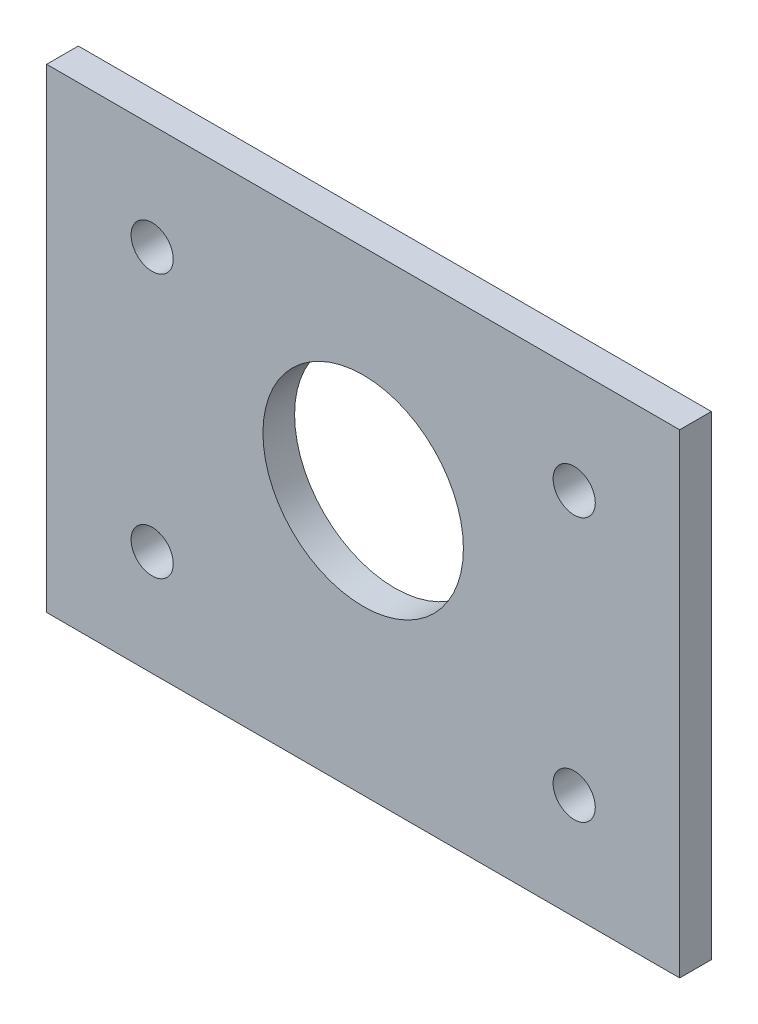
ISO-10303-21;
HEADER;
FILE_DESCRIPTION(('STEP AP214'),'2;1');
FILE_NAME('part.step','',(''),(''),'','','');
FILE_SCHEMA(('AUTOMOTIVE_DESIGN { 1 0 10303 214 1 1 1 1 }'));
ENDSEC;
DATA;
#1=APPLICATION_CONTEXT('core data for automotive mechanical design processes');
#2=APPLICATION_PROTOCOL_DEFINITION('international standard','automotive_design',2000,#1);
#3=PRODUCT_CONTEXT('',#1,'mechanical');
#4=PRODUCT('Part','Part','',(#3));
#5=PRODUCT_RELATED_PRODUCT_CATEGORY('part','',(#4));
#6=PRODUCT_DEFINITION_FORMATION('','',#4);
#7=PRODUCT_DEFINITION_CONTEXT('part definition',#1,'design');
#8=PRODUCT_DEFINITION('design','',#6,#7);
#9=PRODUCT_DEFINITION_SHAPE('','',#8);
#10=(LENGTH_UNIT() NAMED_UNIT(*) SI_UNIT(.MILLI.,.METRE.));
#11=(NAMED_UNIT(*) PLANE_ANGLE_UNIT() SI_UNIT($,.RADIAN.));
#12=(NAMED_UNIT(*) SI_UNIT($,.STERADIAN.) SOLID_ANGLE_UNIT());
#13=UNCERTAINTY_MEASURE_WITH_UNIT(LENGTH_MEASURE(1.E-05),#10,'distance_accuracy_value','');
#14=(GEOMETRIC_REPRESENTATION_CONTEXT(3) GLOBAL_UNCERTAINTY_ASSIGNED_CONTEXT((#13)) GLOBAL_UNIT_ASSIGNED_CONTEXT((#10,
#11,#12)) REPRESENTATION_CONTEXT('',''));
#15=CARTESIAN_POINT('',(0.,0.,0.));
#16=DIRECTION('',(0.,0.,1.));
#17=DIRECTION('',(1.,0.,0.));
#18=AXIS2_PLACEMENT_3D('',#15,#16,#17);
#19=CARTESIAN_POINT('',(0.,22.5,1.5));
#20=DIRECTION('',(0.,1.,0.));
#21=DIRECTION('',(0.,0.,1.));
#22=AXIS2_PLACEMENT_3D('',#19,#20,#21);
#23=PLANE('',#22);
#24=DIRECTION('',(1.,0.,0.));
#25=VECTOR('',#24,1.);
#26=CARTESIAN_POINT('',(0.,22.5,-1.5));
#27=LINE('',#26,#25);
#28=CARTESIAN_POINT('',(-30.,22.5,-1.5));
#29=VERTEX_POINT('',#28);
#30=CARTESIAN_POINT('',(30.,22.5,-1.5));
#31=VERTEX_POINT('',#30);
#32=EDGE_CURVE('E142',#29,#31,#27,.T.);
#33=ORIENTED_EDGE('',*,*,#32,.F.);
#34=DIRECTION('',(0.,0.,-1.));
#35=VECTOR('',#34,1.);
#36=CARTESIAN_POINT('',(-30.,22.5,1.5));
#37=LINE('',#36,#35);
#38=CARTESIAN_POINT('',(-30.,22.5,1.5));
#39=VERTEX_POINT('',#38);
#40=EDGE_CURVE('E11',#39,#29,#37,.T.);
#41=ORIENTED_EDGE('',*,*,#40,.F.);
#42=DIRECTION('',(1.,0.,0.));
#43=VECTOR('',#42,1.);
#44=CARTESIAN_POINT('',(0.,22.5,1.5));
#45=LINE('',#44,#43);
#46=CARTESIAN_POINT('',(30.,22.5,1.5));
#47=VERTEX_POINT('',#46);
#48=EDGE_CURVE('E112',#39,#47,#45,.T.);
#49=ORIENTED_EDGE('',*,*,#48,.T.);
#50=DIRECTION('',(0.,0.,-1.));
#51=VECTOR('',#50,1.);
#52=CARTESIAN_POINT('',(30.,22.5,1.5));
#53=LINE('',#52,#51);
#54=EDGE_CURVE('E88',#47,#31,#53,.T.);
#55=ORIENTED_EDGE('',*,*,#54,.T.);
#56=EDGE_LOOP('',(#33,#41,#49,#55));
#57=FACE_BOUND('',#56,.T.);
#58=ADVANCED_FACE('F47',(#57),#23,.T.);
#59=CARTESIAN_POINT('',(-30.,0.,1.5));
#60=DIRECTION('',(-1.,0.,0.));
#61=DIRECTION('',(0.,0.,1.));
#62=AXIS2_PLACEMENT_3D('',#59,#60,#61);
#63=PLANE('',#62);
#64=DIRECTION('',(0.,1.,0.));
#65=VECTOR('',#64,1.);
#66=CARTESIAN_POINT('',(-30.,0.,-1.5));
#67=LINE('',#66,#65);
#68=CARTESIAN_POINT('',(-30.,-22.5,-1.5));
#69=VERTEX_POINT('',#68);
#70=EDGE_CURVE('E100',#69,#29,#67,.T.);
#71=ORIENTED_EDGE('',*,*,#70,.F.);
#72=DIRECTION('',(0.,0.,-1.));
#73=VECTOR('',#72,1.);
#74=CARTESIAN_POINT('',(-30.,-22.5,1.5));
#75=LINE('',#74,#73);
#76=CARTESIAN_POINT('',(-30.,-22.5,1.5));
#77=VERTEX_POINT('',#76);
#78=EDGE_CURVE('E57',#77,#69,#75,.T.);
#79=ORIENTED_EDGE('',*,*,#78,.F.);
#80=DIRECTION('',(0.,1.,0.));
#81=VECTOR('',#80,1.);
#82=CARTESIAN_POINT('',(-30.,0.,1.5));
#83=LINE('',#82,#81);
#84=EDGE_CURVE('E98',#77,#39,#83,.T.);
#85=ORIENTED_EDGE('',*,*,#84,.T.);
#86=ORIENTED_EDGE('',*,*,#40,.T.);
#87=EDGE_LOOP('',(#71,#79,#85,#86));
#88=FACE_BOUND('',#87,.T.);
#89=ADVANCED_FACE('F96',(#88),#63,.T.);
#90=CARTESIAN_POINT('',(0.,-22.5,1.5));
#91=DIRECTION('',(0.,1.,0.));
#92=DIRECTION('',(0.,0.,1.));
#93=AXIS2_PLACEMENT_3D('',#90,#91,#92);
#94=PLANE('',#93);
#95=DIRECTION('',(1.,0.,0.));
#96=VECTOR('',#95,1.);
#97=CARTESIAN_POINT('',(0.,-22.5,-1.5));
#98=LINE('',#97,#96);
#99=CARTESIAN_POINT('',(30.,-22.5,-1.5));
#100=VERTEX_POINT('',#99);
#101=EDGE_CURVE('E147',#69,#100,#98,.T.);
#102=ORIENTED_EDGE('',*,*,#101,.T.);
#103=DIRECTION('',(0.,0.,-1.));
#104=VECTOR('',#103,1.);
#105=CARTESIAN_POINT('',(30.,-22.5,1.5));
#106=LINE('',#105,#104);
#107=CARTESIAN_POINT('',(30.,-22.5,1.5));
#108=VERTEX_POINT('',#107);
#109=EDGE_CURVE('E104',#108,#100,#106,.T.);
#110=ORIENTED_EDGE('',*,*,#109,.F.);
#111=DIRECTION('',(1.,0.,0.));
#112=VECTOR('',#111,1.);
#113=CARTESIAN_POINT('',(0.,-22.5,1.5));
#114=LINE('',#113,#112);
#115=EDGE_CURVE('E106',#77,#108,#114,.T.);
#116=ORIENTED_EDGE('',*,*,#115,.F.);
#117=ORIENTED_EDGE('',*,*,#78,.T.);
#118=EDGE_LOOP('',(#102,#110,#116,#117));
#119=FACE_BOUND('',#118,.T.);
#120=ADVANCED_FACE('F107',(#119),#94,.F.);
#121=CARTESIAN_POINT('',(19.9999999999999,-12.5,1.5));
#122=DIRECTION('',(0.,0.,-1.));
#123=DIRECTION('',(-1.,0.,0.));
#124=AXIS2_PLACEMENT_3D('',#121,#122,#123);
#125=CYLINDRICAL_SURFACE('',#124,2.00000000000001);
#126=CARTESIAN_POINT('',(19.9999999999999,-12.5,1.5));
#127=DIRECTION('',(0.,0.,1.));
#128=DIRECTION('',(1.,0.,0.));
#129=AXIS2_PLACEMENT_3D('',#126,#127,#128);
#130=CIRCLE('',#129,2.00000000000001);
#131=CARTESIAN_POINT('',(21.9999999999999,-12.5,1.5));
#132=VERTEX_POINT('',#131);
#133=EDGE_CURVE('E122',#132,#132,#130,.T.);
#134=ORIENTED_EDGE('',*,*,#133,.T.);
#135=EDGE_LOOP('',(#134));
#136=FACE_BOUND('',#135,.T.);
#137=CARTESIAN_POINT('',(19.9999999999999,-12.5,-1.5));
#138=DIRECTION('',(0.,0.,1.));
#139=DIRECTION('',(1.,0.,0.));
#140=AXIS2_PLACEMENT_3D('',#137,#138,#139);
#141=CIRCLE('',#140,2.00000000000001);
#142=CARTESIAN_POINT('',(21.9999999999999,-12.5,-1.5));
#143=VERTEX_POINT('',#142);
#144=EDGE_CURVE('E152',#143,#143,#141,.T.);
#145=ORIENTED_EDGE('',*,*,#144,.F.);
#146=EDGE_LOOP('',(#145));
#147=FACE_BOUND('',#146,.T.);
#148=ADVANCED_FACE('F208',(#136,#147),#125,.F.);
#149=CARTESIAN_POINT('',(30.,0.,1.5));
#150=DIRECTION('',(-1.,0.,0.));
#151=DIRECTION('',(0.,0.,1.));
#152=AXIS2_PLACEMENT_3D('',#149,#150,#151);
#153=PLANE('',#152);
#154=DIRECTION('',(0.,1.,0.));
#155=VECTOR('',#154,1.);
#156=CARTESIAN_POINT('',(30.,0.,-1.5));
#157=LINE('',#156,#155);
#158=EDGE_CURVE('E81',#100,#31,#157,.T.);
#159=ORIENTED_EDGE('',*,*,#158,.T.);
#160=ORIENTED_EDGE('',*,*,#54,.F.);
#161=DIRECTION('',(0.,1.,0.));
#162=VECTOR('',#161,1.);
#163=CARTESIAN_POINT('',(30.,0.,1.5));
#164=LINE('',#163,#162);
#165=EDGE_CURVE('E65',#108,#47,#164,.T.);
#166=ORIENTED_EDGE('',*,*,#165,.F.);
#167=ORIENTED_EDGE('',*,*,#109,.T.);
#168=EDGE_LOOP('',(#159,#160,#166,#167));
#169=FACE_BOUND('',#168,.T.);
#170=ADVANCED_FACE('F165',(#169),#153,.F.);
#171=CARTESIAN_POINT('',(19.9999999999999,12.5,1.5));
#172=DIRECTION('',(0.,0.,-1.));
#173=DIRECTION('',(-1.,0.,0.));
#174=AXIS2_PLACEMENT_3D('',#171,#172,#173);
#175=CYLINDRICAL_SURFACE('',#174,2.00000000000001);
#176=CARTESIAN_POINT('',(19.9999999999999,12.5,1.5));
#177=DIRECTION('',(0.,0.,1.));
#178=DIRECTION('',(1.,0.,0.));
#179=AXIS2_PLACEMENT_3D('',#176,#177,#178);
#180=CIRCLE('',#179,2.00000000000001);
#181=CARTESIAN_POINT('',(21.9999999999999,12.5,1.5));
#182=VERTEX_POINT('',#181);
#183=EDGE_CURVE('E116',#182,#182,#180,.F.);
#184=ORIENTED_EDGE('',*,*,#183,.F.);
#185=EDGE_LOOP('',(#184));
#186=FACE_BOUND('',#185,.T.);
#187=CARTESIAN_POINT('',(19.9999999999999,12.5,-1.5));
#188=DIRECTION('',(0.,0.,1.));
#189=DIRECTION('',(1.,0.,0.));
#190=AXIS2_PLACEMENT_3D('',#187,#188,#189);
#191=CIRCLE('',#190,2.00000000000001);
#192=CARTESIAN_POINT('',(21.9999999999999,12.5,-1.5));
#193=VERTEX_POINT('',#192);
#194=EDGE_CURVE('E138',#193,#193,#191,.F.);
#195=ORIENTED_EDGE('',*,*,#194,.T.);
#196=EDGE_LOOP('',(#195));
#197=FACE_BOUND('',#196,.T.);
#198=ADVANCED_FACE('F176',(#186,#197),#175,.F.);
#199=CARTESIAN_POINT('',(0.,2.5,1.5));
#200=DIRECTION('',(0.,0.,-1.));
#201=DIRECTION('',(-1.,0.,0.));
#202=AXIS2_PLACEMENT_3D('',#199,#200,#201);
#203=CYLINDRICAL_SURFACE('',#202,9.5);
#204=CARTESIAN_POINT('',(0.,2.5,1.5));
#205=DIRECTION('',(0.,0.,1.));
#206=DIRECTION('',(1.,0.,0.));
#207=AXIS2_PLACEMENT_3D('',#204,#205,#206);
#208=CIRCLE('',#207,9.5);
#209=CARTESIAN_POINT('',(9.5,2.5,1.5));
#210=VERTEX_POINT('',#209);
#211=EDGE_CURVE('E190',#210,#210,#208,.T.);
#212=ORIENTED_EDGE('',*,*,#211,.T.);
#213=EDGE_LOOP('',(#212));
#214=FACE_BOUND('',#213,.T.);
#215=CARTESIAN_POINT('',(0.,2.5,-1.5));
#216=DIRECTION('',(0.,0.,1.));
#217=DIRECTION('',(1.,0.,0.));
#218=AXIS2_PLACEMENT_3D('',#215,#216,#217);
#219=CIRCLE('',#218,9.5);
#220=CARTESIAN_POINT('',(9.5,2.5,-1.5));
#221=VERTEX_POINT('',#220);
#222=EDGE_CURVE('E134',#221,#221,#219,.T.);
#223=ORIENTED_EDGE('',*,*,#222,.F.);
#224=EDGE_LOOP('',(#223));
#225=FACE_BOUND('',#224,.T.);
#226=ADVANCED_FACE('F178',(#214,#225),#203,.F.);
#227=CARTESIAN_POINT('',(-20.,12.5,1.5));
#228=DIRECTION('',(0.,0.,-1.));
#229=DIRECTION('',(-1.,0.,0.));
#230=AXIS2_PLACEMENT_3D('',#227,#228,#229);
#231=CYLINDRICAL_SURFACE('',#230,2.);
#232=CARTESIAN_POINT('',(-20.,12.5,1.5));
#233=DIRECTION('',(0.,0.,1.));
#234=DIRECTION('',(1.,0.,0.));
#235=AXIS2_PLACEMENT_3D('',#232,#233,#234);
#236=CIRCLE('',#235,2.);
#237=CARTESIAN_POINT('',(-18.,12.5,1.5));
#238=VERTEX_POINT('',#237);
#239=EDGE_CURVE('E160',#238,#238,#236,.T.);
#240=ORIENTED_EDGE('',*,*,#239,.T.);
#241=EDGE_LOOP('',(#240));
#242=FACE_BOUND('',#241,.T.);
#243=CARTESIAN_POINT('',(-20.,12.5,-1.5));
#244=DIRECTION('',(0.,0.,1.));
#245=DIRECTION('',(1.,0.,0.));
#246=AXIS2_PLACEMENT_3D('',#243,#244,#245);
#247=CIRCLE('',#246,2.);
#248=CARTESIAN_POINT('',(-18.,12.5,-1.5));
#249=VERTEX_POINT('',#248);
#250=EDGE_CURVE('E130',#249,#249,#247,.T.);
#251=ORIENTED_EDGE('',*,*,#250,.F.);
#252=EDGE_LOOP('',(#251));
#253=FACE_BOUND('',#252,.T.);
#254=ADVANCED_FACE('F49',(#242,#253),#231,.F.);
#255=CARTESIAN_POINT('',(-20.,-12.5,1.5));
#256=DIRECTION('',(0.,0.,-1.));
#257=DIRECTION('',(-1.,0.,0.));
#258=AXIS2_PLACEMENT_3D('',#255,#256,#257);
#259=CYLINDRICAL_SURFACE('',#258,2.);
#260=CARTESIAN_POINT('',(-20.,-12.5,1.5));
#261=DIRECTION('',(0.,0.,1.));
#262=DIRECTION('',(1.,0.,0.));
#263=AXIS2_PLACEMENT_3D('',#260,#261,#262);
#264=CIRCLE('',#263,2.);
#265=CARTESIAN_POINT('',(-18.,-12.5,1.5));
#266=VERTEX_POINT('',#265);
#267=EDGE_CURVE('E126',#266,#266,#264,.F.);
#268=ORIENTED_EDGE('',*,*,#267,.F.);
#269=EDGE_LOOP('',(#268));
#270=FACE_BOUND('',#269,.T.);
#271=CARTESIAN_POINT('',(-20.,-12.5,-1.5));
#272=DIRECTION('',(0.,0.,1.));
#273=DIRECTION('',(1.,0.,0.));
#274=AXIS2_PLACEMENT_3D('',#271,#272,#273);
#275=CIRCLE('',#274,2.);
#276=CARTESIAN_POINT('',(-18.,-12.5,-1.5));
#277=VERTEX_POINT('',#276);
#278=EDGE_CURVE('E156',#277,#277,#275,.F.);
#279=ORIENTED_EDGE('',*,*,#278,.T.);
#280=EDGE_LOOP('',(#279));
#281=FACE_BOUND('',#280,.T.);
#282=ADVANCED_FACE('F185',(#270,#281),#259,.F.);
#283=CARTESIAN_POINT('',(0.,0.,1.5));
#284=DIRECTION('',(0.,0.,1.));
#285=DIRECTION('',(1.,0.,0.));
#286=AXIS2_PLACEMENT_3D('',#283,#284,#285);
#287=PLANE('',#286);
#288=ORIENTED_EDGE('',*,*,#239,.F.);
#289=EDGE_LOOP('',(#288));
#290=FACE_BOUND('',#289,.T.);
#291=ORIENTED_EDGE('',*,*,#211,.F.);
#292=EDGE_LOOP('',(#291));
#293=FACE_BOUND('',#292,.T.);
#294=ORIENTED_EDGE('',*,*,#183,.T.);
#295=EDGE_LOOP('',(#294));
#296=FACE_BOUND('',#295,.T.);
#297=ORIENTED_EDGE('',*,*,#48,.F.);
#298=ORIENTED_EDGE('',*,*,#84,.F.);
#299=ORIENTED_EDGE('',*,*,#115,.T.);
#300=ORIENTED_EDGE('',*,*,#165,.T.);
#301=EDGE_LOOP('',(#297,#298,#299,#300));
#302=FACE_BOUND('',#301,.T.);
#303=ORIENTED_EDGE('',*,*,#133,.F.);
#304=EDGE_LOOP('',(#303));
#305=FACE_BOUND('',#304,.T.);
#306=ORIENTED_EDGE('',*,*,#267,.T.);
#307=EDGE_LOOP('',(#306));
#308=FACE_BOUND('',#307,.T.);
#309=ADVANCED_FACE('F110',(#290,#293,#296,#302,#305,#308),#287,.T.);
#310=CARTESIAN_POINT('',(0.,0.,-1.5));
#311=DIRECTION('',(0.,0.,1.));
#312=DIRECTION('',(1.,0.,0.));
#313=AXIS2_PLACEMENT_3D('',#310,#311,#312);
#314=PLANE('',#313);
#315=ORIENTED_EDGE('',*,*,#250,.T.);
#316=EDGE_LOOP('',(#315));
#317=FACE_BOUND('',#316,.T.);
#318=ORIENTED_EDGE('',*,*,#222,.T.);
#319=EDGE_LOOP('',(#318));
#320=FACE_BOUND('',#319,.T.);
#321=ORIENTED_EDGE('',*,*,#194,.F.);
#322=EDGE_LOOP('',(#321));
#323=FACE_BOUND('',#322,.T.);
#324=ORIENTED_EDGE('',*,*,#32,.T.);
#325=ORIENTED_EDGE('',*,*,#158,.F.);
#326=ORIENTED_EDGE('',*,*,#101,.F.);
#327=ORIENTED_EDGE('',*,*,#70,.T.);
#328=EDGE_LOOP('',(#324,#325,#326,#327));
#329=FACE_BOUND('',#328,.T.);
#330=ORIENTED_EDGE('',*,*,#144,.T.);
#331=EDGE_LOOP('',(#330));
#332=FACE_BOUND('',#331,.T.);
#333=ORIENTED_EDGE('',*,*,#278,.F.);
#334=EDGE_LOOP('',(#333));
#335=FACE_BOUND('',#334,.T.);
#336=ADVANCED_FACE('F166',(#317,#320,#323,#329,#332,#335),#314,.F.);
#337=CLOSED_SHELL('',(#58,#89,#120,#148,#170,#198,#226,#254,#282,#309,#336));
#338=MANIFOLD_SOLID_BREP('B2',#337);
#339=ADVANCED_BREP_SHAPE_REPRESENTATION('',(#18,#338),#14);
#340=SHAPE_DEFINITION_REPRESENTATION(#9,#339);
ENDSEC;
END-ISO-10303-21;
